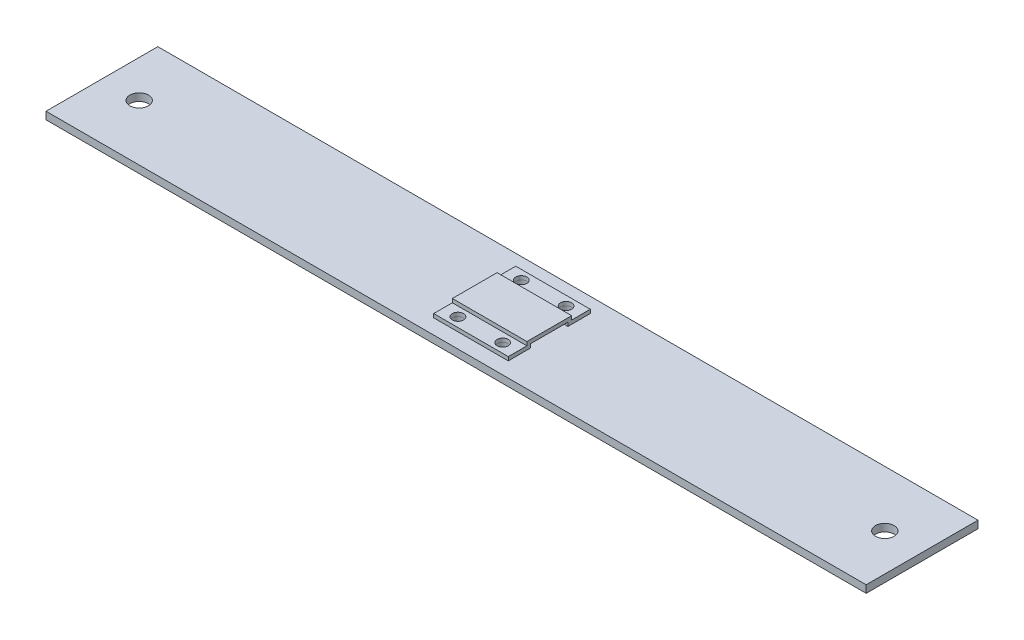
ISO-10303-21;
HEADER;
FILE_DESCRIPTION(('STEP AP214'),'2;1');
FILE_NAME('part.step','',(''),(''),'','','');
FILE_SCHEMA(('AUTOMOTIVE_DESIGN { 1 0 10303 214 1 1 1 1 }'));
ENDSEC;
DATA;
#1=APPLICATION_CONTEXT('core data for automotive mechanical design processes');
#2=APPLICATION_PROTOCOL_DEFINITION('international standard','automotive_design',2000,#1);
#3=PRODUCT_CONTEXT('',#1,'mechanical');
#4=PRODUCT('Part','Part','',(#3));
#5=PRODUCT_RELATED_PRODUCT_CATEGORY('part','',(#4));
#6=PRODUCT_DEFINITION_FORMATION('','',#4);
#7=PRODUCT_DEFINITION_CONTEXT('part definition',#1,'design');
#8=PRODUCT_DEFINITION('design','',#6,#7);
#9=PRODUCT_DEFINITION_SHAPE('','',#8);
#10=(LENGTH_UNIT() NAMED_UNIT(*) SI_UNIT(.MILLI.,.METRE.));
#11=(NAMED_UNIT(*) PLANE_ANGLE_UNIT() SI_UNIT($,.RADIAN.));
#12=(NAMED_UNIT(*) SI_UNIT($,.STERADIAN.) SOLID_ANGLE_UNIT());
#13=UNCERTAINTY_MEASURE_WITH_UNIT(LENGTH_MEASURE(1.E-05),#10,'distance_accuracy_value','');
#14=(GEOMETRIC_REPRESENTATION_CONTEXT(3) GLOBAL_UNCERTAINTY_ASSIGNED_CONTEXT((#13)) GLOBAL_UNIT_ASSIGNED_CONTEXT((#10,
#11,#12)) REPRESENTATION_CONTEXT('',''));
#15=CARTESIAN_POINT('',(0.,0.,0.));
#16=DIRECTION('',(0.,0.,1.));
#17=DIRECTION('',(1.,0.,0.));
#18=AXIS2_PLACEMENT_3D('',#15,#16,#17);
#19=CARTESIAN_POINT('',(10.,3.,6.));
#20=DIRECTION('',(0.,-1.,0.));
#21=DIRECTION('',(0.,0.,-1.));
#22=AXIS2_PLACEMENT_3D('',#19,#20,#21);
#23=PLANE('',#22);
#24=CARTESIAN_POINT('',(-6.,3.,8.5));
#25=DIRECTION('',(0.,1.,0.));
#26=DIRECTION('',(0.,0.,1.));
#27=AXIS2_PLACEMENT_3D('',#24,#25,#26);
#28=CIRCLE('',#27,1.5);
#29=CARTESIAN_POINT('',(-6.,3.,10.));
#30=VERTEX_POINT('',#29);
#31=EDGE_CURVE('E319',#30,#30,#28,.T.);
#32=ORIENTED_EDGE('',*,*,#31,.F.);
#33=EDGE_LOOP('',(#32));
#34=FACE_BOUND('',#33,.T.);
#35=CARTESIAN_POINT('',(6.,3.,8.5));
#36=DIRECTION('',(0.,1.,0.));
#37=DIRECTION('',(0.,0.,1.));
#38=AXIS2_PLACEMENT_3D('',#35,#36,#37);
#39=CIRCLE('',#38,1.5);
#40=CARTESIAN_POINT('',(6.,3.,10.));
#41=VERTEX_POINT('',#40);
#42=EDGE_CURVE('E322',#41,#41,#39,.T.);
#43=ORIENTED_EDGE('',*,*,#42,.F.);
#44=EDGE_LOOP('',(#43));
#45=FACE_BOUND('',#44,.T.);
#46=DIRECTION('',(0.,0.,1.));
#47=VECTOR('',#46,1.);
#48=CARTESIAN_POINT('',(-10.,3.,6.));
#49=LINE('',#48,#47);
#50=CARTESIAN_POINT('',(-10.,3.,6.));
#51=VERTEX_POINT('',#50);
#52=CARTESIAN_POINT('',(-10.,3.,11.));
#53=VERTEX_POINT('',#52);
#54=EDGE_CURVE('E205',#51,#53,#49,.T.);
#55=ORIENTED_EDGE('',*,*,#54,.T.);
#56=DIRECTION('',(-1.,0.,0.));
#57=VECTOR('',#56,1.);
#58=CARTESIAN_POINT('',(10.,3.,11.));
#59=LINE('',#58,#57);
#60=CARTESIAN_POINT('',(10.,3.,11.));
#61=VERTEX_POINT('',#60);
#62=EDGE_CURVE('E181',#61,#53,#59,.T.);
#63=ORIENTED_EDGE('',*,*,#62,.F.);
#64=DIRECTION('',(0.,0.,1.));
#65=VECTOR('',#64,1.);
#66=CARTESIAN_POINT('',(10.,3.,6.));
#67=LINE('',#66,#65);
#68=CARTESIAN_POINT('',(10.,3.,6.));
#69=VERTEX_POINT('',#68);
#70=EDGE_CURVE('E179',#69,#61,#67,.T.);
#71=ORIENTED_EDGE('',*,*,#70,.F.);
#72=DIRECTION('',(-1.,0.,0.));
#73=VECTOR('',#72,1.);
#74=CARTESIAN_POINT('',(10.,3.,6.));
#75=LINE('',#74,#73);
#76=EDGE_CURVE('E209',#69,#51,#75,.T.);
#77=ORIENTED_EDGE('',*,*,#76,.T.);
#78=EDGE_LOOP('',(#55,#63,#71,#77));
#79=FACE_BOUND('',#78,.T.);
#80=ADVANCED_FACE('F48',(#34,#45,#79),#23,.F.);
#81=CARTESIAN_POINT('',(10.,3.,6.));
#82=DIRECTION('',(0.,0.,-1.));
#83=DIRECTION('',(-1.,0.,0.));
#84=AXIS2_PLACEMENT_3D('',#81,#82,#83);
#85=PLANE('',#84);
#86=DIRECTION('',(0.,-1.,0.));
#87=VECTOR('',#86,1.);
#88=CARTESIAN_POINT('',(-10.,3.,6.));
#89=LINE('',#88,#87);
#90=CARTESIAN_POINT('',(-10.,4.,6.));
#91=VERTEX_POINT('',#90);
#92=EDGE_CURVE('E203',#91,#51,#89,.T.);
#93=ORIENTED_EDGE('',*,*,#92,.T.);
#94=ORIENTED_EDGE('',*,*,#76,.F.);
#95=DIRECTION('',(0.,-1.,0.));
#96=VECTOR('',#95,1.);
#97=CARTESIAN_POINT('',(10.,3.,6.));
#98=LINE('',#97,#96);
#99=CARTESIAN_POINT('',(10.,4.,6.));
#100=VERTEX_POINT('',#99);
#101=EDGE_CURVE('E177',#100,#69,#98,.T.);
#102=ORIENTED_EDGE('',*,*,#101,.F.);
#103=DIRECTION('',(-1.,0.,0.));
#104=VECTOR('',#103,1.);
#105=CARTESIAN_POINT('',(10.,4.,6.));
#106=LINE('',#105,#104);
#107=EDGE_CURVE('E212',#100,#91,#106,.T.);
#108=ORIENTED_EDGE('',*,*,#107,.T.);
#109=EDGE_LOOP('',(#93,#94,#102,#108));
#110=FACE_BOUND('',#109,.T.);
#111=ADVANCED_FACE('F278',(#110),#85,.F.);
#112=CARTESIAN_POINT('',(10.,4.,6.));
#113=DIRECTION('',(0.,-1.,0.));
#114=DIRECTION('',(0.,0.,-1.));
#115=AXIS2_PLACEMENT_3D('',#112,#113,#114);
#116=PLANE('',#115);
#117=DIRECTION('',(0.,0.,1.));
#118=VECTOR('',#117,1.);
#119=CARTESIAN_POINT('',(-10.,4.,6.));
#120=LINE('',#119,#118);
#121=CARTESIAN_POINT('',(-10.,4.,-6.));
#122=VERTEX_POINT('',#121);
#123=EDGE_CURVE('E201',#122,#91,#120,.T.);
#124=ORIENTED_EDGE('',*,*,#123,.T.);
#125=ORIENTED_EDGE('',*,*,#107,.F.);
#126=DIRECTION('',(0.,0.,1.));
#127=VECTOR('',#126,1.);
#128=CARTESIAN_POINT('',(10.,4.,6.));
#129=LINE('',#128,#127);
#130=CARTESIAN_POINT('',(10.,4.,-6.));
#131=VERTEX_POINT('',#130);
#132=EDGE_CURVE('E175',#131,#100,#129,.T.);
#133=ORIENTED_EDGE('',*,*,#132,.F.);
#134=DIRECTION('',(-1.,0.,0.));
#135=VECTOR('',#134,1.);
#136=CARTESIAN_POINT('',(10.,4.,-6.));
#137=LINE('',#136,#135);
#138=EDGE_CURVE('E215',#131,#122,#137,.T.);
#139=ORIENTED_EDGE('',*,*,#138,.T.);
#140=EDGE_LOOP('',(#124,#125,#133,#139));
#141=FACE_BOUND('',#140,.T.);
#142=ADVANCED_FACE('F282',(#141),#116,.F.);
#143=CARTESIAN_POINT('',(10.,4.,-6.));
#144=DIRECTION('',(0.,0.,1.));
#145=DIRECTION('',(1.,0.,0.));
#146=AXIS2_PLACEMENT_3D('',#143,#144,#145);
#147=PLANE('',#146);
#148=DIRECTION('',(0.,1.,0.));
#149=VECTOR('',#148,1.);
#150=CARTESIAN_POINT('',(-10.,4.,-6.));
#151=LINE('',#150,#149);
#152=CARTESIAN_POINT('',(-10.,3.,-6.));
#153=VERTEX_POINT('',#152);
#154=EDGE_CURVE('E199',#153,#122,#151,.T.);
#155=ORIENTED_EDGE('',*,*,#154,.T.);
#156=ORIENTED_EDGE('',*,*,#138,.F.);
#157=DIRECTION('',(0.,1.,0.));
#158=VECTOR('',#157,1.);
#159=CARTESIAN_POINT('',(10.,4.,-6.));
#160=LINE('',#159,#158);
#161=CARTESIAN_POINT('',(10.,3.,-6.));
#162=VERTEX_POINT('',#161);
#163=EDGE_CURVE('E173',#162,#131,#160,.T.);
#164=ORIENTED_EDGE('',*,*,#163,.F.);
#165=DIRECTION('',(-1.,0.,0.));
#166=VECTOR('',#165,1.);
#167=CARTESIAN_POINT('',(10.,3.,-6.));
#168=LINE('',#167,#166);
#169=EDGE_CURVE('E218',#162,#153,#168,.T.);
#170=ORIENTED_EDGE('',*,*,#169,.T.);
#171=EDGE_LOOP('',(#155,#156,#164,#170));
#172=FACE_BOUND('',#171,.T.);
#173=ADVANCED_FACE('F286',(#172),#147,.F.);
#174=CARTESIAN_POINT('',(10.,3.,-11.));
#175=DIRECTION('',(0.,-1.,0.));
#176=DIRECTION('',(0.,0.,-1.));
#177=AXIS2_PLACEMENT_3D('',#174,#175,#176);
#178=PLANE('',#177);
#179=CARTESIAN_POINT('',(6.,3.,-8.5));
#180=DIRECTION('',(0.,1.,0.));
#181=DIRECTION('',(0.,0.,1.));
#182=AXIS2_PLACEMENT_3D('',#179,#180,#181);
#183=CIRCLE('',#182,1.5);
#184=CARTESIAN_POINT('',(6.,3.,-7.));
#185=VERTEX_POINT('',#184);
#186=EDGE_CURVE('E318',#185,#185,#183,.T.);
#187=ORIENTED_EDGE('',*,*,#186,.F.);
#188=EDGE_LOOP('',(#187));
#189=FACE_BOUND('',#188,.T.);
#190=CARTESIAN_POINT('',(-6.,3.,-8.5));
#191=DIRECTION('',(0.,1.,0.));
#192=DIRECTION('',(0.,0.,1.));
#193=AXIS2_PLACEMENT_3D('',#190,#191,#192);
#194=CIRCLE('',#193,1.5);
#195=CARTESIAN_POINT('',(-6.,3.,-7.));
#196=VERTEX_POINT('',#195);
#197=EDGE_CURVE('E185',#196,#196,#194,.T.);
#198=ORIENTED_EDGE('',*,*,#197,.F.);
#199=EDGE_LOOP('',(#198));
#200=FACE_BOUND('',#199,.T.);
#201=DIRECTION('',(0.,0.,1.));
#202=VECTOR('',#201,1.);
#203=CARTESIAN_POINT('',(-10.,3.,-11.));
#204=LINE('',#203,#202);
#205=CARTESIAN_POINT('',(-10.,3.,-11.));
#206=VERTEX_POINT('',#205);
#207=EDGE_CURVE('E197',#206,#153,#204,.T.);
#208=ORIENTED_EDGE('',*,*,#207,.T.);
#209=ORIENTED_EDGE('',*,*,#169,.F.);
#210=DIRECTION('',(0.,0.,1.));
#211=VECTOR('',#210,1.);
#212=CARTESIAN_POINT('',(10.,3.,-11.));
#213=LINE('',#212,#211);
#214=CARTESIAN_POINT('',(10.,3.,-11.));
#215=VERTEX_POINT('',#214);
#216=EDGE_CURVE('E171',#215,#162,#213,.T.);
#217=ORIENTED_EDGE('',*,*,#216,.F.);
#218=DIRECTION('',(-1.,0.,0.));
#219=VECTOR('',#218,1.);
#220=CARTESIAN_POINT('',(10.,3.,-11.));
#221=LINE('',#220,#219);
#222=EDGE_CURVE('E221',#215,#206,#221,.T.);
#223=ORIENTED_EDGE('',*,*,#222,.T.);
#224=EDGE_LOOP('',(#208,#209,#217,#223));
#225=FACE_BOUND('',#224,.T.);
#226=ADVANCED_FACE('F290',(#189,#200,#225),#178,.F.);
#227=CARTESIAN_POINT('',(10.,2.,-11.));
#228=DIRECTION('',(0.,0.,1.));
#229=DIRECTION('',(0.,-1.,0.));
#230=AXIS2_PLACEMENT_3D('',#227,#228,#229);
#231=PLANE('',#230);
#232=DIRECTION('',(0.,1.,0.));
#233=VECTOR('',#232,1.);
#234=CARTESIAN_POINT('',(-10.,2.,-11.));
#235=LINE('',#234,#233);
#236=CARTESIAN_POINT('',(-10.,2.,-11.));
#237=VERTEX_POINT('',#236);
#238=EDGE_CURVE('E195',#237,#206,#235,.T.);
#239=ORIENTED_EDGE('',*,*,#238,.T.);
#240=ORIENTED_EDGE('',*,*,#222,.F.);
#241=DIRECTION('',(0.,1.,0.));
#242=VECTOR('',#241,1.);
#243=CARTESIAN_POINT('',(10.,2.,-11.));
#244=LINE('',#243,#242);
#245=CARTESIAN_POINT('',(10.,2.,-11.));
#246=VERTEX_POINT('',#245);
#247=EDGE_CURVE('E164',#246,#215,#244,.T.);
#248=ORIENTED_EDGE('',*,*,#247,.F.);
#249=DIRECTION('',(-1.,0.,0.));
#250=VECTOR('',#249,1.);
#251=CARTESIAN_POINT('',(10.,2.,-11.));
#252=LINE('',#251,#250);
#253=EDGE_CURVE('E224',#246,#237,#252,.T.);
#254=ORIENTED_EDGE('',*,*,#253,.T.);
#255=EDGE_LOOP('',(#239,#240,#248,#254));
#256=FACE_BOUND('',#255,.T.);
#257=ADVANCED_FACE('F294',(#256),#231,.F.);
#258=CARTESIAN_POINT('',(10.,4.,-5.));
#259=DIRECTION('',(0.,0.,1.));
#260=DIRECTION('',(1.,0.,0.));
#261=AXIS2_PLACEMENT_3D('',#258,#259,#260);
#262=PLANE('',#261);
#263=DIRECTION('',(0.,1.,0.));
#264=VECTOR('',#263,1.);
#265=CARTESIAN_POINT('',(-10.,4.,-5.));
#266=LINE('',#265,#264);
#267=CARTESIAN_POINT('',(-10.,2.,-5.));
#268=VERTEX_POINT('',#267);
#269=CARTESIAN_POINT('',(-10.,3.,-5.));
#270=VERTEX_POINT('',#269);
#271=EDGE_CURVE('E190',#268,#270,#266,.T.);
#272=ORIENTED_EDGE('',*,*,#271,.F.);
#273=DIRECTION('',(-1.,0.,0.));
#274=VECTOR('',#273,1.);
#275=CARTESIAN_POINT('',(10.,2.,-5.));
#276=LINE('',#275,#274);
#277=CARTESIAN_POINT('',(10.,2.,-5.));
#278=VERTEX_POINT('',#277);
#279=EDGE_CURVE('E169',#278,#268,#276,.T.);
#280=ORIENTED_EDGE('',*,*,#279,.F.);
#281=DIRECTION('',(0.,1.,0.));
#282=VECTOR('',#281,1.);
#283=CARTESIAN_POINT('',(10.,4.,-5.));
#284=LINE('',#283,#282);
#285=CARTESIAN_POINT('',(10.,3.,-5.));
#286=VERTEX_POINT('',#285);
#287=EDGE_CURVE('E162',#278,#286,#284,.T.);
#288=ORIENTED_EDGE('',*,*,#287,.T.);
#289=DIRECTION('',(-1.,0.,0.));
#290=VECTOR('',#289,1.);
#291=CARTESIAN_POINT('',(10.,3.,-5.));
#292=LINE('',#291,#290);
#293=EDGE_CURVE('E150',#286,#270,#292,.T.);
#294=ORIENTED_EDGE('',*,*,#293,.T.);
#295=EDGE_LOOP('',(#272,#280,#288,#294));
#296=FACE_BOUND('',#295,.T.);
#297=ADVANCED_FACE('F298',(#296),#262,.T.);
#298=CARTESIAN_POINT('',(10.,3.,6.));
#299=DIRECTION('',(0.,-1.,0.));
#300=DIRECTION('',(0.,0.,-1.));
#301=AXIS2_PLACEMENT_3D('',#298,#299,#300);
#302=PLANE('',#301);
#303=DIRECTION('',(0.,0.,-1.));
#304=VECTOR('',#303,1.);
#305=CARTESIAN_POINT('',(-10.,3.,6.));
#306=LINE('',#305,#304);
#307=CARTESIAN_POINT('',(-10.,3.,5.));
#308=VERTEX_POINT('',#307);
#309=EDGE_CURVE('E188',#270,#308,#306,.F.);
#310=ORIENTED_EDGE('',*,*,#309,.F.);
#311=ORIENTED_EDGE('',*,*,#293,.F.);
#312=DIRECTION('',(0.,0.,-1.));
#313=VECTOR('',#312,1.);
#314=CARTESIAN_POINT('',(10.,3.,6.));
#315=LINE('',#314,#313);
#316=CARTESIAN_POINT('',(10.,3.,5.));
#317=VERTEX_POINT('',#316);
#318=EDGE_CURVE('E157',#286,#317,#315,.F.);
#319=ORIENTED_EDGE('',*,*,#318,.T.);
#320=DIRECTION('',(-1.,0.,0.));
#321=VECTOR('',#320,1.);
#322=CARTESIAN_POINT('',(10.,3.,5.));
#323=LINE('',#322,#321);
#324=EDGE_CURVE('E140',#317,#308,#323,.T.);
#325=ORIENTED_EDGE('',*,*,#324,.T.);
#326=EDGE_LOOP('',(#310,#311,#319,#325));
#327=FACE_BOUND('',#326,.T.);
#328=ADVANCED_FACE('F161',(#327),#302,.T.);
#329=CARTESIAN_POINT('',(10.,3.,5.));
#330=DIRECTION('',(0.,0.,-1.));
#331=DIRECTION('',(-1.,0.,0.));
#332=AXIS2_PLACEMENT_3D('',#329,#330,#331);
#333=PLANE('',#332);
#334=DIRECTION('',(0.,1.,0.));
#335=VECTOR('',#334,1.);
#336=CARTESIAN_POINT('',(-10.,3.,5.));
#337=LINE('',#336,#335);
#338=CARTESIAN_POINT('',(-10.,2.,5.));
#339=VERTEX_POINT('',#338);
#340=EDGE_CURVE('E145',#308,#339,#337,.F.);
#341=ORIENTED_EDGE('',*,*,#340,.F.);
#342=ORIENTED_EDGE('',*,*,#324,.F.);
#343=DIRECTION('',(0.,1.,0.));
#344=VECTOR('',#343,1.);
#345=CARTESIAN_POINT('',(10.,3.,5.));
#346=LINE('',#345,#344);
#347=CARTESIAN_POINT('',(10.,2.,5.));
#348=VERTEX_POINT('',#347);
#349=EDGE_CURVE('E143',#317,#348,#346,.F.);
#350=ORIENTED_EDGE('',*,*,#349,.T.);
#351=DIRECTION('',(-1.,0.,0.));
#352=VECTOR('',#351,1.);
#353=CARTESIAN_POINT('',(10.,2.,5.));
#354=LINE('',#353,#352);
#355=EDGE_CURVE('E71',#348,#339,#354,.T.);
#356=ORIENTED_EDGE('',*,*,#355,.T.);
#357=EDGE_LOOP('',(#341,#342,#350,#356));
#358=FACE_BOUND('',#357,.T.);
#359=ADVANCED_FACE('F142',(#358),#333,.T.);
#360=CARTESIAN_POINT('',(10.,3.,11.));
#361=DIRECTION('',(0.,0.,-1.));
#362=DIRECTION('',(0.,1.,0.));
#363=AXIS2_PLACEMENT_3D('',#360,#361,#362);
#364=PLANE('',#363);
#365=DIRECTION('',(0.,-1.,0.));
#366=VECTOR('',#365,1.);
#367=CARTESIAN_POINT('',(-10.,3.,11.));
#368=LINE('',#367,#366);
#369=CARTESIAN_POINT('',(-10.,2.,11.));
#370=VERTEX_POINT('',#369);
#371=EDGE_CURVE('E182',#53,#370,#368,.T.);
#372=ORIENTED_EDGE('',*,*,#371,.T.);
#373=DIRECTION('',(-1.,0.,0.));
#374=VECTOR('',#373,1.);
#375=CARTESIAN_POINT('',(10.,2.,11.));
#376=LINE('',#375,#374);
#377=CARTESIAN_POINT('',(10.,2.,11.));
#378=VERTEX_POINT('',#377);
#379=EDGE_CURVE('E65',#378,#370,#376,.T.);
#380=ORIENTED_EDGE('',*,*,#379,.F.);
#381=DIRECTION('',(0.,-1.,0.));
#382=VECTOR('',#381,1.);
#383=CARTESIAN_POINT('',(10.,3.,11.));
#384=LINE('',#383,#382);
#385=EDGE_CURVE('E159',#61,#378,#384,.T.);
#386=ORIENTED_EDGE('',*,*,#385,.F.);
#387=ORIENTED_EDGE('',*,*,#62,.T.);
#388=EDGE_LOOP('',(#372,#380,#386,#387));
#389=FACE_BOUND('',#388,.T.);
#390=ADVANCED_FACE('F272',(#389),#364,.F.);
#391=CARTESIAN_POINT('',(10.,0.,0.));
#392=DIRECTION('',(-1.,0.,0.));
#393=DIRECTION('',(0.,0.,1.));
#394=AXIS2_PLACEMENT_3D('',#391,#392,#393);
#395=PLANE('',#394);
#396=ORIENTED_EDGE('',*,*,#385,.T.);
#397=DIRECTION('',(0.,0.,1.));
#398=VECTOR('',#397,1.);
#399=CARTESIAN_POINT('',(10.,2.,10.));
#400=LINE('',#399,#398);
#401=EDGE_CURVE('E12',#348,#378,#400,.T.);
#402=ORIENTED_EDGE('',*,*,#401,.F.);
#403=ORIENTED_EDGE('',*,*,#349,.F.);
#404=ORIENTED_EDGE('',*,*,#318,.F.);
#405=ORIENTED_EDGE('',*,*,#287,.F.);
#406=DIRECTION('',(0.,0.,1.));
#407=VECTOR('',#406,1.);
#408=CARTESIAN_POINT('',(10.,2.,-11.));
#409=LINE('',#408,#407);
#410=EDGE_CURVE('E57',#246,#278,#409,.T.);
#411=ORIENTED_EDGE('',*,*,#410,.F.);
#412=ORIENTED_EDGE('',*,*,#247,.T.);
#413=ORIENTED_EDGE('',*,*,#216,.T.);
#414=ORIENTED_EDGE('',*,*,#163,.T.);
#415=ORIENTED_EDGE('',*,*,#132,.T.);
#416=ORIENTED_EDGE('',*,*,#101,.T.);
#417=ORIENTED_EDGE('',*,*,#70,.T.);
#418=EDGE_LOOP('',(#396,#402,#403,#404,#405,#411,#412,#413,#414,#415,#416,#417));
#419=FACE_BOUND('',#418,.T.);
#420=ADVANCED_FACE('F155',(#419),#395,.F.);
#421=CARTESIAN_POINT('',(-10.,0.,0.));
#422=DIRECTION('',(-1.,0.,0.));
#423=DIRECTION('',(0.,0.,1.));
#424=AXIS2_PLACEMENT_3D('',#421,#422,#423);
#425=PLANE('',#424);
#426=ORIENTED_EDGE('',*,*,#371,.F.);
#427=ORIENTED_EDGE('',*,*,#54,.F.);
#428=ORIENTED_EDGE('',*,*,#92,.F.);
#429=ORIENTED_EDGE('',*,*,#123,.F.);
#430=ORIENTED_EDGE('',*,*,#154,.F.);
#431=ORIENTED_EDGE('',*,*,#207,.F.);
#432=ORIENTED_EDGE('',*,*,#238,.F.);
#433=DIRECTION('',(0.,0.,1.));
#434=VECTOR('',#433,1.);
#435=CARTESIAN_POINT('',(-10.,2.,-11.));
#436=LINE('',#435,#434);
#437=EDGE_CURVE('E193',#237,#268,#436,.T.);
#438=ORIENTED_EDGE('',*,*,#437,.T.);
#439=ORIENTED_EDGE('',*,*,#271,.T.);
#440=ORIENTED_EDGE('',*,*,#309,.T.);
#441=ORIENTED_EDGE('',*,*,#340,.T.);
#442=DIRECTION('',(0.,0.,1.));
#443=VECTOR('',#442,1.);
#444=CARTESIAN_POINT('',(-10.,2.,6.));
#445=LINE('',#444,#443);
#446=EDGE_CURVE('E184',#339,#370,#445,.T.);
#447=ORIENTED_EDGE('',*,*,#446,.T.);
#448=EDGE_LOOP('',(#426,#427,#428,#429,#430,#431,#432,#438,#439,#440,#441,#447));
#449=FACE_BOUND('',#448,.T.);
#450=ADVANCED_FACE('F271',(#449),#425,.T.);
#451=CARTESIAN_POINT('',(6.,-4.24264068711929,8.5));
#452=DIRECTION('',(0.,1.,0.));
#453=DIRECTION('',(0.,0.,1.));
#454=AXIS2_PLACEMENT_3D('',#451,#452,#453);
#455=CYLINDRICAL_SURFACE('',#454,1.5);
#456=CARTESIAN_POINT('',(6.,2.,8.5));
#457=DIRECTION('',(0.,1.,0.));
#458=DIRECTION('',(0.,0.,1.));
#459=AXIS2_PLACEMENT_3D('',#456,#457,#458);
#460=CIRCLE('',#459,1.5);
#461=CARTESIAN_POINT('',(6.,2.,10.));
#462=VERTEX_POINT('',#461);
#463=EDGE_CURVE('E52',#462,#462,#460,.F.);
#464=ORIENTED_EDGE('',*,*,#463,.T.);
#465=EDGE_LOOP('',(#464));
#466=FACE_BOUND('',#465,.T.);
#467=ORIENTED_EDGE('',*,*,#42,.T.);
#468=EDGE_LOOP('',(#467));
#469=FACE_BOUND('',#468,.T.);
#470=ADVANCED_FACE('F243',(#466,#469),#455,.F.);
#471=CARTESIAN_POINT('',(-6.,-4.24264068711929,8.5));
#472=DIRECTION('',(0.,1.,0.));
#473=DIRECTION('',(0.,0.,1.));
#474=AXIS2_PLACEMENT_3D('',#471,#472,#473);
#475=CYLINDRICAL_SURFACE('',#474,1.5);
#476=CARTESIAN_POINT('',(-6.,2.,8.5));
#477=DIRECTION('',(0.,1.,0.));
#478=DIRECTION('',(0.,0.,1.));
#479=AXIS2_PLACEMENT_3D('',#476,#477,#478);
#480=CIRCLE('',#479,1.5);
#481=CARTESIAN_POINT('',(-6.,2.,10.));
#482=VERTEX_POINT('',#481);
#483=EDGE_CURVE('E236',#482,#482,#480,.F.);
#484=ORIENTED_EDGE('',*,*,#483,.T.);
#485=EDGE_LOOP('',(#484));
#486=FACE_BOUND('',#485,.T.);
#487=ORIENTED_EDGE('',*,*,#31,.T.);
#488=EDGE_LOOP('',(#487));
#489=FACE_BOUND('',#488,.T.);
#490=ADVANCED_FACE('F261',(#486,#489),#475,.F.);
#491=CARTESIAN_POINT('',(-6.,-4.24264068711929,-8.5));
#492=DIRECTION('',(0.,1.,0.));
#493=DIRECTION('',(0.,0.,1.));
#494=AXIS2_PLACEMENT_3D('',#491,#492,#493);
#495=CYLINDRICAL_SURFACE('',#494,1.5);
#496=CARTESIAN_POINT('',(-6.,2.,-8.5));
#497=DIRECTION('',(0.,1.,0.));
#498=DIRECTION('',(0.,0.,1.));
#499=AXIS2_PLACEMENT_3D('',#496,#497,#498);
#500=CIRCLE('',#499,1.5);
#501=CARTESIAN_POINT('',(-6.,2.,-7.));
#502=VERTEX_POINT('',#501);
#503=EDGE_CURVE('E234',#502,#502,#500,.F.);
#504=ORIENTED_EDGE('',*,*,#503,.T.);
#505=EDGE_LOOP('',(#504));
#506=FACE_BOUND('',#505,.T.);
#507=ORIENTED_EDGE('',*,*,#197,.T.);
#508=EDGE_LOOP('',(#507));
#509=FACE_BOUND('',#508,.T.);
#510=ADVANCED_FACE('F255',(#506,#509),#495,.F.);
#511=CARTESIAN_POINT('',(6.,-4.24264068711929,-8.5));
#512=DIRECTION('',(0.,1.,0.));
#513=DIRECTION('',(0.,0.,1.));
#514=AXIS2_PLACEMENT_3D('',#511,#512,#513);
#515=CYLINDRICAL_SURFACE('',#514,1.5);
#516=CARTESIAN_POINT('',(6.,2.,-8.5));
#517=DIRECTION('',(0.,1.,0.));
#518=DIRECTION('',(0.,0.,1.));
#519=AXIS2_PLACEMENT_3D('',#516,#517,#518);
#520=CIRCLE('',#519,1.5);
#521=CARTESIAN_POINT('',(6.,2.,-7.));
#522=VERTEX_POINT('',#521);
#523=EDGE_CURVE('E230',#522,#522,#520,.F.);
#524=ORIENTED_EDGE('',*,*,#523,.T.);
#525=EDGE_LOOP('',(#524));
#526=FACE_BOUND('',#525,.T.);
#527=ORIENTED_EDGE('',*,*,#186,.T.);
#528=EDGE_LOOP('',(#527));
#529=FACE_BOUND('',#528,.T.);
#530=ADVANCED_FACE('F249',(#526,#529),#515,.F.);
#531=CARTESIAN_POINT('',(110.,2.,-15.));
#532=DIRECTION('',(0.,1.,0.));
#533=DIRECTION('',(0.,0.,1.));
#534=AXIS2_PLACEMENT_3D('',#531,#532,#533);
#535=PLANE('',#534);
#536=ORIENTED_EDGE('',*,*,#410,.T.);
#537=ORIENTED_EDGE('',*,*,#279,.T.);
#538=ORIENTED_EDGE('',*,*,#437,.F.);
#539=ORIENTED_EDGE('',*,*,#253,.F.);
#540=EDGE_LOOP('',(#536,#537,#538,#539));
#541=FACE_BOUND('',#540,.T.);
#542=ORIENTED_EDGE('',*,*,#523,.F.);
#543=EDGE_LOOP('',(#542));
#544=FACE_BOUND('',#543,.T.);
#545=ORIENTED_EDGE('',*,*,#503,.F.);
#546=EDGE_LOOP('',(#545));
#547=FACE_BOUND('',#546,.T.);
#548=ADVANCED_FACE('F248',(#541,#544,#547),#535,.F.);
#549=ORIENTED_EDGE('',*,*,#401,.T.);
#550=ORIENTED_EDGE('',*,*,#379,.T.);
#551=ORIENTED_EDGE('',*,*,#446,.F.);
#552=ORIENTED_EDGE('',*,*,#355,.F.);
#553=EDGE_LOOP('',(#549,#550,#551,#552));
#554=FACE_BOUND('',#553,.T.);
#555=ORIENTED_EDGE('',*,*,#463,.F.);
#556=EDGE_LOOP('',(#555));
#557=FACE_BOUND('',#556,.T.);
#558=ORIENTED_EDGE('',*,*,#483,.F.);
#559=EDGE_LOOP('',(#558));
#560=FACE_BOUND('',#559,.T.);
#561=ADVANCED_FACE('F50',(#554,#557,#560),#535,.F.);
#562=CLOSED_SHELL('',(#80,#111,#142,#173,#226,#257,#297,#328,#359,#390,#420,#450,#470,#490,#510,
#530,#548,#561));
#563=MANIFOLD_SOLID_BREP('B2',#562);
#564=CARTESIAN_POINT('',(110.,2.,-15.));
#565=DIRECTION('',(0.,1.,0.));
#566=DIRECTION('',(0.,0.,1.));
#567=AXIS2_PLACEMENT_3D('',#564,#565,#566);
#568=PLANE('',#567);
#569=CARTESIAN_POINT('',(-100.,2.,0.));
#570=DIRECTION('',(0.,1.,0.));
#571=DIRECTION('',(0.,0.,1.));
#572=AXIS2_PLACEMENT_3D('',#569,#570,#571);
#573=CIRCLE('',#572,2.50000000000001);
#574=CARTESIAN_POINT('',(-100.,2.,2.50000000000001));
#575=VERTEX_POINT('',#574);
#576=EDGE_CURVE('E589',#575,#575,#573,.T.);
#577=ORIENTED_EDGE('',*,*,#576,.F.);
#578=EDGE_LOOP('',(#577));
#579=FACE_BOUND('',#578,.T.);
#580=CARTESIAN_POINT('',(100.,2.,0.));
#581=DIRECTION('',(0.,1.,0.));
#582=DIRECTION('',(0.,0.,1.));
#583=AXIS2_PLACEMENT_3D('',#580,#581,#582);
#584=CIRCLE('',#583,2.50000000000001);
#585=CARTESIAN_POINT('',(100.,2.,2.50000000000001));
#586=VERTEX_POINT('',#585);
#587=EDGE_CURVE('E603',#586,#586,#584,.T.);
#588=ORIENTED_EDGE('',*,*,#587,.F.);
#589=EDGE_LOOP('',(#588));
#590=FACE_BOUND('',#589,.T.);
#591=CARTESIAN_POINT('',(-6.,2.,8.5));
#592=DIRECTION('',(0.,1.,0.));
#593=DIRECTION('',(0.,0.,1.));
#594=AXIS2_PLACEMENT_3D('',#591,#592,#593);
#595=CIRCLE('',#594,1.5);
#596=CARTESIAN_POINT('',(-6.,2.,10.));
#597=VERTEX_POINT('',#596);
#598=EDGE_CURVE('E582',#597,#597,#595,.F.);
#599=ORIENTED_EDGE('',*,*,#598,.T.);
#600=EDGE_LOOP('',(#599));
#601=FACE_BOUND('',#600,.T.);
#602=CARTESIAN_POINT('',(6.,2.,8.5));
#603=DIRECTION('',(0.,1.,0.));
#604=DIRECTION('',(0.,0.,1.));
#605=AXIS2_PLACEMENT_3D('',#602,#603,#604);
#606=CIRCLE('',#605,1.5);
#607=CARTESIAN_POINT('',(6.,2.,10.));
#608=VERTEX_POINT('',#607);
#609=EDGE_CURVE('E578',#608,#608,#606,.F.);
#610=ORIENTED_EDGE('',*,*,#609,.T.);
#611=EDGE_LOOP('',(#610));
#612=FACE_BOUND('',#611,.T.);
#613=DIRECTION('',(0.,0.,-1.));
#614=VECTOR('',#613,1.);
#615=CARTESIAN_POINT('',(110.,2.,15.));
#616=LINE('',#615,#614);
#617=CARTESIAN_POINT('',(110.,2.,15.));
#618=VERTEX_POINT('',#617);
#619=CARTESIAN_POINT('',(110.,2.,-15.));
#620=VERTEX_POINT('',#619);
#621=EDGE_CURVE('E559',#618,#620,#616,.T.);
#622=ORIENTED_EDGE('',*,*,#621,.T.);
#623=DIRECTION('',(-1.,0.,0.));
#624=VECTOR('',#623,1.);
#625=CARTESIAN_POINT('',(-110.,2.,-15.));
#626=LINE('',#625,#624);
#627=CARTESIAN_POINT('',(-110.,2.,-15.));
#628=VERTEX_POINT('',#627);
#629=EDGE_CURVE('E529',#620,#628,#626,.T.);
#630=ORIENTED_EDGE('',*,*,#629,.T.);
#631=DIRECTION('',(0.,0.,1.));
#632=VECTOR('',#631,1.);
#633=CARTESIAN_POINT('',(-110.,2.,15.));
#634=LINE('',#633,#632);
#635=CARTESIAN_POINT('',(-110.,2.,15.));
#636=VERTEX_POINT('',#635);
#637=EDGE_CURVE('E568',#628,#636,#634,.T.);
#638=ORIENTED_EDGE('',*,*,#637,.T.);
#639=DIRECTION('',(1.,0.,0.));
#640=VECTOR('',#639,1.);
#641=CARTESIAN_POINT('',(-110.,2.,15.));
#642=LINE('',#641,#640);
#643=EDGE_CURVE('E553',#636,#618,#642,.T.);
#644=ORIENTED_EDGE('',*,*,#643,.T.);
#645=EDGE_LOOP('',(#622,#630,#638,#644));
#646=FACE_BOUND('',#645,.T.);
#647=CARTESIAN_POINT('',(-6.,2.,-8.5));
#648=DIRECTION('',(0.,1.,0.));
#649=DIRECTION('',(0.,0.,1.));
#650=AXIS2_PLACEMENT_3D('',#647,#648,#649);
#651=CIRCLE('',#650,1.5);
#652=CARTESIAN_POINT('',(-6.,2.,-7.));
#653=VERTEX_POINT('',#652);
#654=EDGE_CURVE('E584',#653,#653,#651,.F.);
#655=ORIENTED_EDGE('',*,*,#654,.T.);
#656=EDGE_LOOP('',(#655));
#657=FACE_BOUND('',#656,.T.);
#658=CARTESIAN_POINT('',(6.,2.,-8.5));
#659=DIRECTION('',(0.,1.,0.));
#660=DIRECTION('',(0.,0.,1.));
#661=AXIS2_PLACEMENT_3D('',#658,#659,#660);
#662=CIRCLE('',#661,1.5);
#663=CARTESIAN_POINT('',(6.,2.,-7.));
#664=VERTEX_POINT('',#663);
#665=EDGE_CURVE('E498',#664,#664,#662,.F.);
#666=ORIENTED_EDGE('',*,*,#665,.T.);
#667=EDGE_LOOP('',(#666));
#668=FACE_BOUND('',#667,.T.);
#669=ADVANCED_FACE('F494',(#579,#590,#601,#612,#646,#657,#668),#568,.T.);
#670=CARTESIAN_POINT('',(-110.,2.,-15.));
#671=DIRECTION('',(0.,0.,1.));
#672=DIRECTION('',(1.,0.,0.));
#673=AXIS2_PLACEMENT_3D('',#670,#671,#672);
#674=PLANE('',#673);
#675=DIRECTION('',(-1.,0.,0.));
#676=VECTOR('',#675,1.);
#677=CARTESIAN_POINT('',(-110.,0.,-15.));
#678=LINE('',#677,#676);
#679=CARTESIAN_POINT('',(110.,0.,-15.));
#680=VERTEX_POINT('',#679);
#681=CARTESIAN_POINT('',(-110.,0.,-15.));
#682=VERTEX_POINT('',#681);
#683=EDGE_CURVE('E513',#680,#682,#678,.T.);
#684=ORIENTED_EDGE('',*,*,#683,.T.);
#685=DIRECTION('',(0.,-1.,0.));
#686=VECTOR('',#685,1.);
#687=CARTESIAN_POINT('',(-110.,2.,-15.));
#688=LINE('',#687,#686);
#689=EDGE_CURVE('E550',#628,#682,#688,.T.);
#690=ORIENTED_EDGE('',*,*,#689,.F.);
#691=ORIENTED_EDGE('',*,*,#629,.F.);
#692=DIRECTION('',(0.,-1.,0.));
#693=VECTOR('',#692,1.);
#694=CARTESIAN_POINT('',(110.,2.,-15.));
#695=LINE('',#694,#693);
#696=EDGE_CURVE('E581',#620,#680,#695,.T.);
#697=ORIENTED_EDGE('',*,*,#696,.T.);
#698=EDGE_LOOP('',(#684,#690,#691,#697));
#699=FACE_BOUND('',#698,.T.);
#700=ADVANCED_FACE('F608',(#699),#674,.F.);
#701=CARTESIAN_POINT('',(-110.,2.,15.));
#702=DIRECTION('',(1.,0.,0.));
#703=DIRECTION('',(0.,0.,-1.));
#704=AXIS2_PLACEMENT_3D('',#701,#702,#703);
#705=PLANE('',#704);
#706=DIRECTION('',(0.,0.,1.));
#707=VECTOR('',#706,1.);
#708=CARTESIAN_POINT('',(-110.,0.,15.));
#709=LINE('',#708,#707);
#710=CARTESIAN_POINT('',(-110.,0.,15.));
#711=VERTEX_POINT('',#710);
#712=EDGE_CURVE('E545',#682,#711,#709,.T.);
#713=ORIENTED_EDGE('',*,*,#712,.T.);
#714=DIRECTION('',(0.,-1.,0.));
#715=VECTOR('',#714,1.);
#716=CARTESIAN_POINT('',(-110.,2.,15.));
#717=LINE('',#716,#715);
#718=EDGE_CURVE('E548',#636,#711,#717,.T.);
#719=ORIENTED_EDGE('',*,*,#718,.F.);
#720=ORIENTED_EDGE('',*,*,#637,.F.);
#721=ORIENTED_EDGE('',*,*,#689,.T.);
#722=EDGE_LOOP('',(#713,#719,#720,#721));
#723=FACE_BOUND('',#722,.T.);
#724=ADVANCED_FACE('F546',(#723),#705,.F.);
#725=CARTESIAN_POINT('',(110.,2.,15.));
#726=DIRECTION('',(-1.,0.,0.));
#727=DIRECTION('',(0.,0.,1.));
#728=AXIS2_PLACEMENT_3D('',#725,#726,#727);
#729=PLANE('',#728);
#730=DIRECTION('',(0.,0.,-1.));
#731=VECTOR('',#730,1.);
#732=CARTESIAN_POINT('',(110.,0.,15.));
#733=LINE('',#732,#731);
#734=CARTESIAN_POINT('',(110.,0.,15.));
#735=VERTEX_POINT('',#734);
#736=EDGE_CURVE('E558',#735,#680,#733,.T.);
#737=ORIENTED_EDGE('',*,*,#736,.T.);
#738=ORIENTED_EDGE('',*,*,#696,.F.);
#739=ORIENTED_EDGE('',*,*,#621,.F.);
#740=DIRECTION('',(0.,-1.,0.));
#741=VECTOR('',#740,1.);
#742=CARTESIAN_POINT('',(110.,2.,15.));
#743=LINE('',#742,#741);
#744=EDGE_CURVE('E554',#618,#735,#743,.T.);
#745=ORIENTED_EDGE('',*,*,#744,.T.);
#746=EDGE_LOOP('',(#737,#738,#739,#745));
#747=FACE_BOUND('',#746,.T.);
#748=ADVANCED_FACE('F611',(#747),#729,.F.);
#749=CARTESIAN_POINT('',(0.,0.,0.));
#750=DIRECTION('',(0.,-1.,0.));
#751=DIRECTION('',(0.,0.,-1.));
#752=AXIS2_PLACEMENT_3D('',#749,#750,#751);
#753=PLANE('',#752);
#754=CARTESIAN_POINT('',(-100.,0.,0.));
#755=DIRECTION('',(0.,-1.,0.));
#756=DIRECTION('',(0.,0.,-1.));
#757=AXIS2_PLACEMENT_3D('',#754,#755,#756);
#758=CIRCLE('',#757,2.50000000000001);
#759=CARTESIAN_POINT('',(-100.,0.,-2.50000000000001));
#760=VERTEX_POINT('',#759);
#761=EDGE_CURVE('E593',#760,#760,#758,.F.);
#762=ORIENTED_EDGE('',*,*,#761,.T.);
#763=EDGE_LOOP('',(#762));
#764=FACE_BOUND('',#763,.T.);
#765=CARTESIAN_POINT('',(100.,0.,0.));
#766=DIRECTION('',(0.,-1.,0.));
#767=DIRECTION('',(0.,0.,-1.));
#768=AXIS2_PLACEMENT_3D('',#765,#766,#767);
#769=CIRCLE('',#768,2.50000000000001);
#770=CARTESIAN_POINT('',(100.,0.,-2.50000000000001));
#771=VERTEX_POINT('',#770);
#772=EDGE_CURVE('E598',#771,#771,#769,.F.);
#773=ORIENTED_EDGE('',*,*,#772,.T.);
#774=EDGE_LOOP('',(#773));
#775=FACE_BOUND('',#774,.T.);
#776=CARTESIAN_POINT('',(6.,0.,-8.5));
#777=DIRECTION('',(0.,-1.,0.));
#778=DIRECTION('',(0.,0.,-1.));
#779=AXIS2_PLACEMENT_3D('',#776,#777,#778);
#780=CIRCLE('',#779,1.5);
#781=CARTESIAN_POINT('',(6.,0.,-10.));
#782=VERTEX_POINT('',#781);
#783=EDGE_CURVE('E573',#782,#782,#780,.F.);
#784=ORIENTED_EDGE('',*,*,#783,.T.);
#785=EDGE_LOOP('',(#784));
#786=FACE_BOUND('',#785,.T.);
#787=CARTESIAN_POINT('',(-6.,0.,8.5));
#788=DIRECTION('',(0.,-1.,0.));
#789=DIRECTION('',(0.,0.,-1.));
#790=AXIS2_PLACEMENT_3D('',#787,#788,#789);
#791=CIRCLE('',#790,1.5);
#792=CARTESIAN_POINT('',(-6.,0.,7.));
#793=VERTEX_POINT('',#792);
#794=EDGE_CURVE('E504',#793,#793,#791,.F.);
#795=ORIENTED_EDGE('',*,*,#794,.T.);
#796=EDGE_LOOP('',(#795));
#797=FACE_BOUND('',#796,.T.);
#798=CARTESIAN_POINT('',(6.,0.,8.5));
#799=DIRECTION('',(0.,-1.,0.));
#800=DIRECTION('',(0.,0.,-1.));
#801=AXIS2_PLACEMENT_3D('',#798,#799,#800);
#802=CIRCLE('',#801,1.5);
#803=CARTESIAN_POINT('',(6.,0.,7.));
#804=VERTEX_POINT('',#803);
#805=EDGE_CURVE('E46',#804,#804,#802,.F.);
#806=ORIENTED_EDGE('',*,*,#805,.T.);
#807=EDGE_LOOP('',(#806));
#808=FACE_BOUND('',#807,.T.);
#809=CARTESIAN_POINT('',(-6.,0.,-8.5));
#810=DIRECTION('',(0.,-1.,0.));
#811=DIRECTION('',(0.,0.,-1.));
#812=AXIS2_PLACEMENT_3D('',#809,#810,#811);
#813=CIRCLE('',#812,1.5);
#814=CARTESIAN_POINT('',(-6.,0.,-10.));
#815=VERTEX_POINT('',#814);
#816=EDGE_CURVE('E566',#815,#815,#813,.F.);
#817=ORIENTED_EDGE('',*,*,#816,.T.);
#818=EDGE_LOOP('',(#817));
#819=FACE_BOUND('',#818,.T.);
#820=ORIENTED_EDGE('',*,*,#736,.F.);
#821=DIRECTION('',(1.,0.,0.));
#822=VECTOR('',#821,1.);
#823=CARTESIAN_POINT('',(-110.,0.,15.));
#824=LINE('',#823,#822);
#825=EDGE_CURVE('E539',#711,#735,#824,.T.);
#826=ORIENTED_EDGE('',*,*,#825,.F.);
#827=ORIENTED_EDGE('',*,*,#712,.F.);
#828=ORIENTED_EDGE('',*,*,#683,.F.);
#829=EDGE_LOOP('',(#820,#826,#827,#828));
#830=FACE_BOUND('',#829,.T.);
#831=ADVANCED_FACE('F556',(#764,#775,#786,#797,#808,#819,#830),#753,.T.);
#832=CARTESIAN_POINT('',(-100.,-0.00100000000000013,0.));
#833=DIRECTION('',(0.,1.,0.));
#834=DIRECTION('',(0.,0.,1.));
#835=AXIS2_PLACEMENT_3D('',#832,#833,#834);
#836=CYLINDRICAL_SURFACE('',#835,2.50000000000001);
#837=ORIENTED_EDGE('',*,*,#761,.F.);
#838=EDGE_LOOP('',(#837));
#839=FACE_BOUND('',#838,.T.);
#840=ORIENTED_EDGE('',*,*,#576,.T.);
#841=EDGE_LOOP('',(#840));
#842=FACE_BOUND('',#841,.T.);
#843=ADVANCED_FACE('F650',(#839,#842),#836,.F.);
#844=CARTESIAN_POINT('',(100.,-0.00100000000000013,0.));
#845=DIRECTION('',(0.,1.,0.));
#846=DIRECTION('',(0.,0.,1.));
#847=AXIS2_PLACEMENT_3D('',#844,#845,#846);
#848=CYLINDRICAL_SURFACE('',#847,2.50000000000001);
#849=ORIENTED_EDGE('',*,*,#772,.F.);
#850=EDGE_LOOP('',(#849));
#851=FACE_BOUND('',#850,.T.);
#852=ORIENTED_EDGE('',*,*,#587,.T.);
#853=EDGE_LOOP('',(#852));
#854=FACE_BOUND('',#853,.T.);
#855=ADVANCED_FACE('F660',(#851,#854),#848,.F.);
#856=CARTESIAN_POINT('',(-110.,2.,15.));
#857=DIRECTION('',(0.,0.,-1.));
#858=DIRECTION('',(-1.,0.,0.));
#859=AXIS2_PLACEMENT_3D('',#856,#857,#858);
#860=PLANE('',#859);
#861=ORIENTED_EDGE('',*,*,#825,.T.);
#862=ORIENTED_EDGE('',*,*,#744,.F.);
#863=ORIENTED_EDGE('',*,*,#643,.F.);
#864=ORIENTED_EDGE('',*,*,#718,.T.);
#865=EDGE_LOOP('',(#861,#862,#863,#864));
#866=FACE_BOUND('',#865,.T.);
#867=ADVANCED_FACE('F552',(#866),#860,.F.);
#868=CARTESIAN_POINT('',(6.,-4.24264068711929,8.5));
#869=DIRECTION('',(0.,1.,0.));
#870=DIRECTION('',(0.,0.,1.));
#871=AXIS2_PLACEMENT_3D('',#868,#869,#870);
#872=CYLINDRICAL_SURFACE('',#871,1.5);
#873=ORIENTED_EDGE('',*,*,#805,.F.);
#874=EDGE_LOOP('',(#873));
#875=FACE_BOUND('',#874,.T.);
#876=ORIENTED_EDGE('',*,*,#609,.F.);
#877=EDGE_LOOP('',(#876));
#878=FACE_BOUND('',#877,.T.);
#879=ADVANCED_FACE('F496',(#875,#878),#872,.F.);
#880=CARTESIAN_POINT('',(-6.,-4.24264068711929,8.5));
#881=DIRECTION('',(0.,1.,0.));
#882=DIRECTION('',(0.,0.,1.));
#883=AXIS2_PLACEMENT_3D('',#880,#881,#882);
#884=CYLINDRICAL_SURFACE('',#883,1.5);
#885=ORIENTED_EDGE('',*,*,#794,.F.);
#886=EDGE_LOOP('',(#885));
#887=FACE_BOUND('',#886,.T.);
#888=ORIENTED_EDGE('',*,*,#598,.F.);
#889=EDGE_LOOP('',(#888));
#890=FACE_BOUND('',#889,.T.);
#891=ADVANCED_FACE('F629',(#887,#890),#884,.F.);
#892=CARTESIAN_POINT('',(-6.,-4.24264068711929,-8.5));
#893=DIRECTION('',(0.,1.,0.));
#894=DIRECTION('',(0.,0.,1.));
#895=AXIS2_PLACEMENT_3D('',#892,#893,#894);
#896=CYLINDRICAL_SURFACE('',#895,1.5);
#897=ORIENTED_EDGE('',*,*,#816,.F.);
#898=EDGE_LOOP('',(#897));
#899=FACE_BOUND('',#898,.T.);
#900=ORIENTED_EDGE('',*,*,#654,.F.);
#901=EDGE_LOOP('',(#900));
#902=FACE_BOUND('',#901,.T.);
#903=ADVANCED_FACE('F624',(#899,#902),#896,.F.);
#904=CARTESIAN_POINT('',(6.,-4.24264068711929,-8.5));
#905=DIRECTION('',(0.,1.,0.));
#906=DIRECTION('',(0.,0.,1.));
#907=AXIS2_PLACEMENT_3D('',#904,#905,#906);
#908=CYLINDRICAL_SURFACE('',#907,1.5);
#909=ORIENTED_EDGE('',*,*,#783,.F.);
#910=EDGE_LOOP('',(#909));
#911=FACE_BOUND('',#910,.T.);
#912=ORIENTED_EDGE('',*,*,#665,.F.);
#913=EDGE_LOOP('',(#912));
#914=FACE_BOUND('',#913,.T.);
#915=ADVANCED_FACE('F615',(#911,#914),#908,.F.);
#916=CLOSED_SHELL('',(#669,#700,#724,#748,#831,#843,#855,#867,#879,#891,#903,#915));
#917=MANIFOLD_SOLID_BREP('B6',#916);
#918=ADVANCED_BREP_SHAPE_REPRESENTATION('',(#18,#563,#917),#14);
#919=SHAPE_DEFINITION_REPRESENTATION(#9,#918);
ENDSEC;
END-ISO-10303-21;
